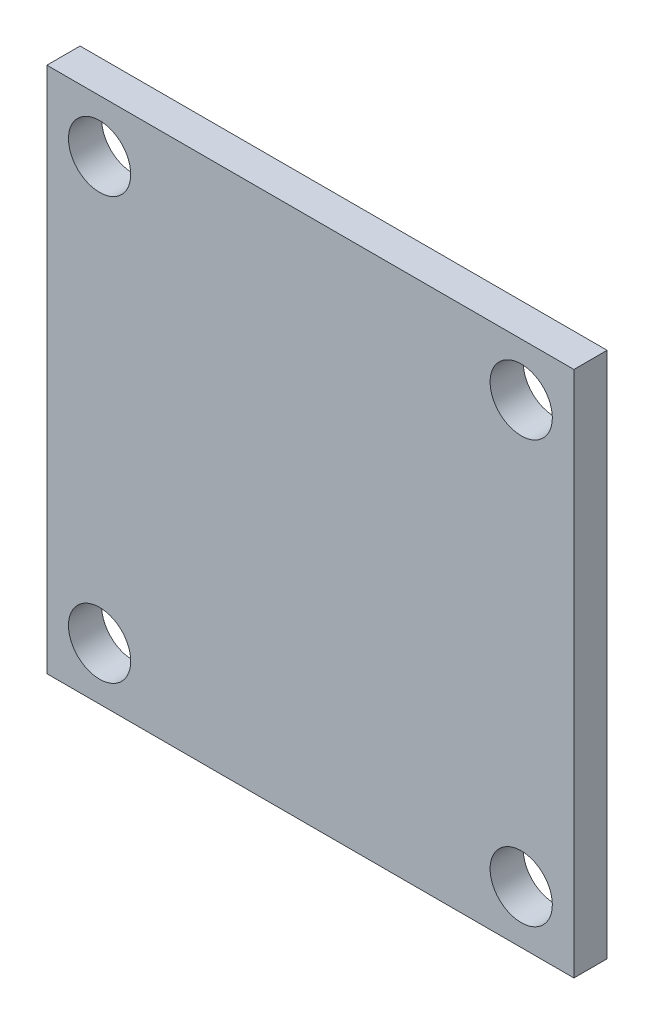
ISO-10303-21;
HEADER;
FILE_DESCRIPTION(('STEP AP214'),'2;1');
FILE_NAME('part.step','',(''),(''),'','','');
FILE_SCHEMA(('AUTOMOTIVE_DESIGN { 1 0 10303 214 1 1 1 1 }'));
ENDSEC;
DATA;
#1=APPLICATION_CONTEXT('core data for automotive mechanical design processes');
#2=APPLICATION_PROTOCOL_DEFINITION('international standard','automotive_design',2000,#1);
#3=PRODUCT_CONTEXT('',#1,'mechanical');
#4=PRODUCT('Part','Part','',(#3));
#5=PRODUCT_RELATED_PRODUCT_CATEGORY('part','',(#4));
#6=PRODUCT_DEFINITION_FORMATION('','',#4);
#7=PRODUCT_DEFINITION_CONTEXT('part definition',#1,'design');
#8=PRODUCT_DEFINITION('design','',#6,#7);
#9=PRODUCT_DEFINITION_SHAPE('','',#8);
#10=(LENGTH_UNIT() NAMED_UNIT(*) SI_UNIT(.MILLI.,.METRE.));
#11=(NAMED_UNIT(*) PLANE_ANGLE_UNIT() SI_UNIT($,.RADIAN.));
#12=(NAMED_UNIT(*) SI_UNIT($,.STERADIAN.) SOLID_ANGLE_UNIT());
#13=UNCERTAINTY_MEASURE_WITH_UNIT(LENGTH_MEASURE(1.E-05),#10,'distance_accuracy_value','');
#14=(GEOMETRIC_REPRESENTATION_CONTEXT(3) GLOBAL_UNCERTAINTY_ASSIGNED_CONTEXT((#13)) GLOBAL_UNIT_ASSIGNED_CONTEXT((#10,
#11,#12)) REPRESENTATION_CONTEXT('',''));
#15=CARTESIAN_POINT('',(0.,0.,0.));
#16=DIRECTION('',(0.,0.,1.));
#17=DIRECTION('',(1.,0.,0.));
#18=AXIS2_PLACEMENT_3D('',#15,#16,#17);
#19=CARTESIAN_POINT('',(0.,0.,1.6));
#20=DIRECTION('',(0.,0.,1.));
#21=DIRECTION('',(1.,0.,0.));
#22=AXIS2_PLACEMENT_3D('',#19,#20,#21);
#23=PLANE('',#22);
#24=CARTESIAN_POINT('',(10.16,-10.16,1.6));
#25=DIRECTION('',(0.,0.,1.));
#26=DIRECTION('',(1.,0.,0.));
#27=AXIS2_PLACEMENT_3D('',#24,#25,#26);
#28=CIRCLE('',#27,1.5);
#29=CARTESIAN_POINT('',(11.66,-10.16,1.6));
#30=VERTEX_POINT('',#29);
#31=EDGE_CURVE('E127',#30,#30,#28,.T.);
#32=ORIENTED_EDGE('',*,*,#31,.F.);
#33=EDGE_LOOP('',(#32));
#34=FACE_BOUND('',#33,.T.);
#35=CARTESIAN_POINT('',(-10.16,10.16,1.6));
#36=DIRECTION('',(0.,0.,1.));
#37=DIRECTION('',(1.,0.,0.));
#38=AXIS2_PLACEMENT_3D('',#35,#36,#37);
#39=CIRCLE('',#38,1.5);
#40=CARTESIAN_POINT('',(-8.66,10.16,1.6));
#41=VERTEX_POINT('',#40);
#42=EDGE_CURVE('E106',#41,#41,#39,.T.);
#43=ORIENTED_EDGE('',*,*,#42,.F.);
#44=EDGE_LOOP('',(#43));
#45=FACE_BOUND('',#44,.T.);
#46=DIRECTION('',(0.,-1.,0.));
#47=VECTOR('',#46,1.);
#48=CARTESIAN_POINT('',(-12.7,12.7,1.6));
#49=LINE('',#48,#47);
#50=CARTESIAN_POINT('',(-12.7,12.7,1.6));
#51=VERTEX_POINT('',#50);
#52=CARTESIAN_POINT('',(-12.7,-12.7,1.6));
#53=VERTEX_POINT('',#52);
#54=EDGE_CURVE('E91',#51,#53,#49,.T.);
#55=ORIENTED_EDGE('',*,*,#54,.T.);
#56=DIRECTION('',(1.,0.,0.));
#57=VECTOR('',#56,1.);
#58=CARTESIAN_POINT('',(-12.7,-12.7,1.6));
#59=LINE('',#58,#57);
#60=CARTESIAN_POINT('',(12.7,-12.7,1.6));
#61=VERTEX_POINT('',#60);
#62=EDGE_CURVE('E86',#53,#61,#59,.T.);
#63=ORIENTED_EDGE('',*,*,#62,.T.);
#64=DIRECTION('',(0.,1.,0.));
#65=VECTOR('',#64,1.);
#66=CARTESIAN_POINT('',(12.7,12.7,1.6));
#67=LINE('',#66,#65);
#68=CARTESIAN_POINT('',(12.7,12.7,1.6));
#69=VERTEX_POINT('',#68);
#70=EDGE_CURVE('E89',#61,#69,#67,.T.);
#71=ORIENTED_EDGE('',*,*,#70,.T.);
#72=DIRECTION('',(-1.,0.,0.));
#73=VECTOR('',#72,1.);
#74=CARTESIAN_POINT('',(-12.7,12.7,1.6));
#75=LINE('',#74,#73);
#76=EDGE_CURVE('E56',#69,#51,#75,.T.);
#77=ORIENTED_EDGE('',*,*,#76,.T.);
#78=EDGE_LOOP('',(#55,#63,#71,#77));
#79=FACE_BOUND('',#78,.T.);
#80=CARTESIAN_POINT('',(10.16,10.16,1.6));
#81=DIRECTION('',(0.,0.,1.));
#82=DIRECTION('',(1.,0.,0.));
#83=AXIS2_PLACEMENT_3D('',#80,#81,#82);
#84=CIRCLE('',#83,1.5);
#85=CARTESIAN_POINT('',(11.66,10.16,1.6));
#86=VERTEX_POINT('',#85);
#87=EDGE_CURVE('E121',#86,#86,#84,.T.);
#88=ORIENTED_EDGE('',*,*,#87,.F.);
#89=EDGE_LOOP('',(#88));
#90=FACE_BOUND('',#89,.T.);
#91=CARTESIAN_POINT('',(-10.16,-10.16,1.6));
#92=DIRECTION('',(0.,0.,1.));
#93=DIRECTION('',(1.,0.,0.));
#94=AXIS2_PLACEMENT_3D('',#91,#92,#93);
#95=CIRCLE('',#94,1.5);
#96=CARTESIAN_POINT('',(-8.66,-10.16,1.6));
#97=VERTEX_POINT('',#96);
#98=EDGE_CURVE('E133',#97,#97,#95,.T.);
#99=ORIENTED_EDGE('',*,*,#98,.F.);
#100=EDGE_LOOP('',(#99));
#101=FACE_BOUND('',#100,.T.);
#102=ADVANCED_FACE('F39',(#34,#45,#79,#90,#101),#23,.T.);
#103=CARTESIAN_POINT('',(0.,0.,0.));
#104=DIRECTION('',(0.,0.,1.));
#105=DIRECTION('',(1.,0.,0.));
#106=AXIS2_PLACEMENT_3D('',#103,#104,#105);
#107=PLANE('',#106);
#108=DIRECTION('',(0.,-1.,0.));
#109=VECTOR('',#108,1.);
#110=CARTESIAN_POINT('',(-12.7,12.7,0.));
#111=LINE('',#110,#109);
#112=CARTESIAN_POINT('',(-12.7,12.7,0.));
#113=VERTEX_POINT('',#112);
#114=CARTESIAN_POINT('',(-12.7,-12.7,0.));
#115=VERTEX_POINT('',#114);
#116=EDGE_CURVE('E103',#113,#115,#111,.T.);
#117=ORIENTED_EDGE('',*,*,#116,.F.);
#118=DIRECTION('',(-1.,0.,0.));
#119=VECTOR('',#118,1.);
#120=CARTESIAN_POINT('',(-12.7,12.7,0.));
#121=LINE('',#120,#119);
#122=CARTESIAN_POINT('',(12.7,12.7,0.));
#123=VERTEX_POINT('',#122);
#124=EDGE_CURVE('E79',#123,#113,#121,.T.);
#125=ORIENTED_EDGE('',*,*,#124,.F.);
#126=DIRECTION('',(0.,1.,0.));
#127=VECTOR('',#126,1.);
#128=CARTESIAN_POINT('',(12.7,12.7,0.));
#129=LINE('',#128,#127);
#130=CARTESIAN_POINT('',(12.7,-12.7,0.));
#131=VERTEX_POINT('',#130);
#132=EDGE_CURVE('E73',#131,#123,#129,.T.);
#133=ORIENTED_EDGE('',*,*,#132,.F.);
#134=DIRECTION('',(1.,0.,0.));
#135=VECTOR('',#134,1.);
#136=CARTESIAN_POINT('',(-12.7,-12.7,0.));
#137=LINE('',#136,#135);
#138=EDGE_CURVE('E95',#115,#131,#137,.T.);
#139=ORIENTED_EDGE('',*,*,#138,.F.);
#140=EDGE_LOOP('',(#117,#125,#133,#139));
#141=FACE_BOUND('',#140,.T.);
#142=CARTESIAN_POINT('',(-10.16,10.16,0.));
#143=DIRECTION('',(0.,0.,1.));
#144=DIRECTION('',(1.,0.,0.));
#145=AXIS2_PLACEMENT_3D('',#142,#143,#144);
#146=CIRCLE('',#145,1.5);
#147=CARTESIAN_POINT('',(-8.66,10.16,0.));
#148=VERTEX_POINT('',#147);
#149=EDGE_CURVE('E118',#148,#148,#146,.T.);
#150=ORIENTED_EDGE('',*,*,#149,.T.);
#151=EDGE_LOOP('',(#150));
#152=FACE_BOUND('',#151,.T.);
#153=CARTESIAN_POINT('',(10.16,10.16,0.));
#154=DIRECTION('',(0.,0.,1.));
#155=DIRECTION('',(1.,0.,0.));
#156=AXIS2_PLACEMENT_3D('',#153,#154,#155);
#157=CIRCLE('',#156,1.5);
#158=CARTESIAN_POINT('',(11.66,10.16,0.));
#159=VERTEX_POINT('',#158);
#160=EDGE_CURVE('E124',#159,#159,#157,.T.);
#161=ORIENTED_EDGE('',*,*,#160,.T.);
#162=EDGE_LOOP('',(#161));
#163=FACE_BOUND('',#162,.T.);
#164=CARTESIAN_POINT('',(10.16,-10.16,0.));
#165=DIRECTION('',(0.,0.,1.));
#166=DIRECTION('',(1.,0.,0.));
#167=AXIS2_PLACEMENT_3D('',#164,#165,#166);
#168=CIRCLE('',#167,1.5);
#169=CARTESIAN_POINT('',(11.66,-10.16,0.));
#170=VERTEX_POINT('',#169);
#171=EDGE_CURVE('E130',#170,#170,#168,.T.);
#172=ORIENTED_EDGE('',*,*,#171,.T.);
#173=EDGE_LOOP('',(#172));
#174=FACE_BOUND('',#173,.T.);
#175=CARTESIAN_POINT('',(-10.16,-10.16,0.));
#176=DIRECTION('',(0.,0.,1.));
#177=DIRECTION('',(1.,0.,0.));
#178=AXIS2_PLACEMENT_3D('',#175,#176,#177);
#179=CIRCLE('',#178,1.5);
#180=CARTESIAN_POINT('',(-8.66,-10.16,0.));
#181=VERTEX_POINT('',#180);
#182=EDGE_CURVE('E136',#181,#181,#179,.T.);
#183=ORIENTED_EDGE('',*,*,#182,.T.);
#184=EDGE_LOOP('',(#183));
#185=FACE_BOUND('',#184,.T.);
#186=ADVANCED_FACE('F114',(#141,#152,#163,#174,#185),#107,.F.);
#187=CARTESIAN_POINT('',(-12.7,12.7,1.6));
#188=DIRECTION('',(1.,0.,0.));
#189=DIRECTION('',(0.,0.,-1.));
#190=AXIS2_PLACEMENT_3D('',#187,#188,#189);
#191=PLANE('',#190);
#192=ORIENTED_EDGE('',*,*,#116,.T.);
#193=DIRECTION('',(0.,0.,-1.));
#194=VECTOR('',#193,1.);
#195=CARTESIAN_POINT('',(-12.7,-12.7,1.6));
#196=LINE('',#195,#194);
#197=EDGE_CURVE('E11',#53,#115,#196,.T.);
#198=ORIENTED_EDGE('',*,*,#197,.F.);
#199=ORIENTED_EDGE('',*,*,#54,.F.);
#200=DIRECTION('',(0.,0.,-1.));
#201=VECTOR('',#200,1.);
#202=CARTESIAN_POINT('',(-12.7,12.7,1.6));
#203=LINE('',#202,#201);
#204=EDGE_CURVE('E99',#51,#113,#203,.T.);
#205=ORIENTED_EDGE('',*,*,#204,.T.);
#206=EDGE_LOOP('',(#192,#198,#199,#205));
#207=FACE_BOUND('',#206,.T.);
#208=ADVANCED_FACE('F41',(#207),#191,.F.);
#209=CARTESIAN_POINT('',(-12.7,-12.7,1.6));
#210=DIRECTION('',(0.,1.,0.));
#211=DIRECTION('',(0.,0.,1.));
#212=AXIS2_PLACEMENT_3D('',#209,#210,#211);
#213=PLANE('',#212);
#214=ORIENTED_EDGE('',*,*,#138,.T.);
#215=DIRECTION('',(0.,0.,-1.));
#216=VECTOR('',#215,1.);
#217=CARTESIAN_POINT('',(12.7,-12.7,1.6));
#218=LINE('',#217,#216);
#219=EDGE_CURVE('E48',#61,#131,#218,.T.);
#220=ORIENTED_EDGE('',*,*,#219,.F.);
#221=ORIENTED_EDGE('',*,*,#62,.F.);
#222=ORIENTED_EDGE('',*,*,#197,.T.);
#223=EDGE_LOOP('',(#214,#220,#221,#222));
#224=FACE_BOUND('',#223,.T.);
#225=ADVANCED_FACE('F94',(#224),#213,.F.);
#226=CARTESIAN_POINT('',(12.7,12.7,1.6));
#227=DIRECTION('',(-1.,0.,0.));
#228=DIRECTION('',(0.,-1.,0.));
#229=AXIS2_PLACEMENT_3D('',#226,#227,#228);
#230=PLANE('',#229);
#231=ORIENTED_EDGE('',*,*,#132,.T.);
#232=DIRECTION('',(0.,0.,-1.));
#233=VECTOR('',#232,1.);
#234=CARTESIAN_POINT('',(12.7,12.7,1.6));
#235=LINE('',#234,#233);
#236=EDGE_CURVE('E96',#69,#123,#235,.T.);
#237=ORIENTED_EDGE('',*,*,#236,.F.);
#238=ORIENTED_EDGE('',*,*,#70,.F.);
#239=ORIENTED_EDGE('',*,*,#219,.T.);
#240=EDGE_LOOP('',(#231,#237,#238,#239));
#241=FACE_BOUND('',#240,.T.);
#242=ADVANCED_FACE('F97',(#241),#230,.F.);
#243=CARTESIAN_POINT('',(-12.7,12.7,1.6));
#244=DIRECTION('',(0.,-1.,0.));
#245=DIRECTION('',(0.,0.,-1.));
#246=AXIS2_PLACEMENT_3D('',#243,#244,#245);
#247=PLANE('',#246);
#248=ORIENTED_EDGE('',*,*,#124,.T.);
#249=ORIENTED_EDGE('',*,*,#204,.F.);
#250=ORIENTED_EDGE('',*,*,#76,.F.);
#251=ORIENTED_EDGE('',*,*,#236,.T.);
#252=EDGE_LOOP('',(#248,#249,#250,#251));
#253=FACE_BOUND('',#252,.T.);
#254=ADVANCED_FACE('F111',(#253),#247,.F.);
#255=CARTESIAN_POINT('',(-10.16,10.16,1.6));
#256=DIRECTION('',(0.,0.,-1.));
#257=DIRECTION('',(-1.,0.,0.));
#258=AXIS2_PLACEMENT_3D('',#255,#256,#257);
#259=CYLINDRICAL_SURFACE('',#258,1.5);
#260=ORIENTED_EDGE('',*,*,#42,.T.);
#261=EDGE_LOOP('',(#260));
#262=FACE_BOUND('',#261,.T.);
#263=ORIENTED_EDGE('',*,*,#149,.F.);
#264=EDGE_LOOP('',(#263));
#265=FACE_BOUND('',#264,.T.);
#266=ADVANCED_FACE('F155',(#262,#265),#259,.F.);
#267=CARTESIAN_POINT('',(10.16,10.16,1.6));
#268=DIRECTION('',(0.,0.,-1.));
#269=DIRECTION('',(-1.,0.,0.));
#270=AXIS2_PLACEMENT_3D('',#267,#268,#269);
#271=CYLINDRICAL_SURFACE('',#270,1.5);
#272=ORIENTED_EDGE('',*,*,#87,.T.);
#273=EDGE_LOOP('',(#272));
#274=FACE_BOUND('',#273,.T.);
#275=ORIENTED_EDGE('',*,*,#160,.F.);
#276=EDGE_LOOP('',(#275));
#277=FACE_BOUND('',#276,.T.);
#278=ADVANCED_FACE('F200',(#274,#277),#271,.F.);
#279=CARTESIAN_POINT('',(10.16,-10.16,1.6));
#280=DIRECTION('',(0.,0.,-1.));
#281=DIRECTION('',(-1.,0.,0.));
#282=AXIS2_PLACEMENT_3D('',#279,#280,#281);
#283=CYLINDRICAL_SURFACE('',#282,1.5);
#284=ORIENTED_EDGE('',*,*,#31,.T.);
#285=EDGE_LOOP('',(#284));
#286=FACE_BOUND('',#285,.T.);
#287=ORIENTED_EDGE('',*,*,#171,.F.);
#288=EDGE_LOOP('',(#287));
#289=FACE_BOUND('',#288,.T.);
#290=ADVANCED_FACE('F208',(#286,#289),#283,.F.);
#291=CARTESIAN_POINT('',(-10.16,-10.16,1.6));
#292=DIRECTION('',(0.,0.,-1.));
#293=DIRECTION('',(-1.,0.,0.));
#294=AXIS2_PLACEMENT_3D('',#291,#292,#293);
#295=CYLINDRICAL_SURFACE('',#294,1.5);
#296=ORIENTED_EDGE('',*,*,#98,.T.);
#297=EDGE_LOOP('',(#296));
#298=FACE_BOUND('',#297,.T.);
#299=ORIENTED_EDGE('',*,*,#182,.F.);
#300=EDGE_LOOP('',(#299));
#301=FACE_BOUND('',#300,.T.);
#302=ADVANCED_FACE('F142',(#298,#301),#295,.F.);
#303=CLOSED_SHELL('',(#102,#186,#208,#225,#242,#254,#266,#278,#290,#302));
#304=MANIFOLD_SOLID_BREP('B2',#303);
#305=ADVANCED_BREP_SHAPE_REPRESENTATION('',(#18,#304),#14);
#306=SHAPE_DEFINITION_REPRESENTATION(#9,#305);
ENDSEC;
END-ISO-10303-21;
